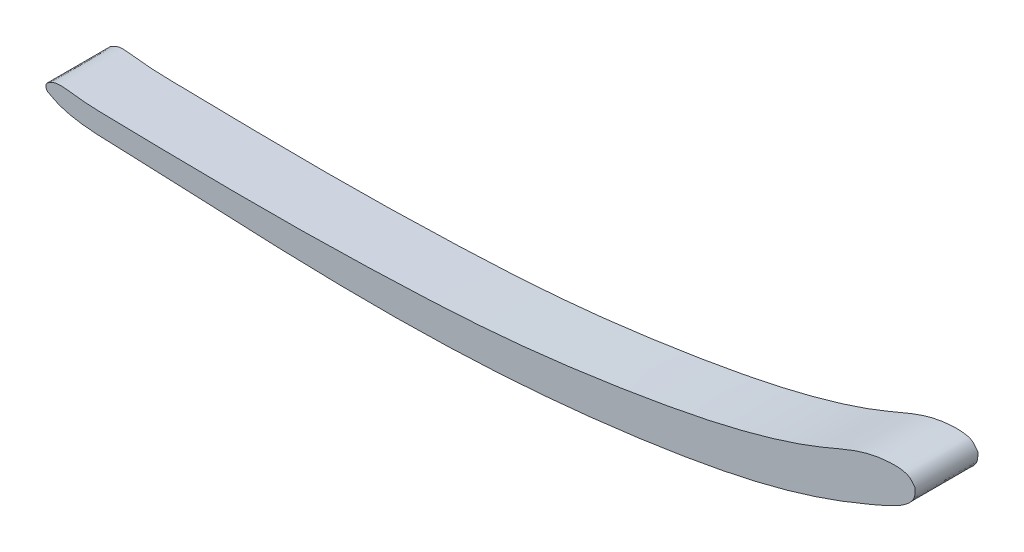
ISO-10303-21;
HEADER;
FILE_DESCRIPTION(('STEP AP214'),'2;1');
FILE_NAME('part.step','',(''),(''),'','','');
FILE_SCHEMA(('AUTOMOTIVE_DESIGN { 1 0 10303 214 1 1 1 1 }'));
ENDSEC;
DATA;
#1=APPLICATION_CONTEXT('core data for automotive mechanical design processes');
#2=APPLICATION_PROTOCOL_DEFINITION('international standard','automotive_design',2000,#1);
#3=PRODUCT_CONTEXT('',#1,'mechanical');
#4=PRODUCT('Part','Part','',(#3));
#5=PRODUCT_RELATED_PRODUCT_CATEGORY('part','',(#4));
#6=PRODUCT_DEFINITION_FORMATION('','',#4);
#7=PRODUCT_DEFINITION_CONTEXT('part definition',#1,'design');
#8=PRODUCT_DEFINITION('design','',#6,#7);
#9=PRODUCT_DEFINITION_SHAPE('','',#8);
#10=(LENGTH_UNIT() NAMED_UNIT(*) SI_UNIT(.MILLI.,.METRE.));
#11=(NAMED_UNIT(*) PLANE_ANGLE_UNIT() SI_UNIT($,.RADIAN.));
#12=(NAMED_UNIT(*) SI_UNIT($,.STERADIAN.) SOLID_ANGLE_UNIT());
#13=UNCERTAINTY_MEASURE_WITH_UNIT(LENGTH_MEASURE(1.E-05),#10,'distance_accuracy_value','');
#14=(GEOMETRIC_REPRESENTATION_CONTEXT(3) GLOBAL_UNCERTAINTY_ASSIGNED_CONTEXT((#13)) GLOBAL_UNIT_ASSIGNED_CONTEXT((#10,
#11,#12)) REPRESENTATION_CONTEXT('',''));
#15=CARTESIAN_POINT('',(0.,0.,0.));
#16=DIRECTION('',(0.,0.,1.));
#17=DIRECTION('',(1.,0.,0.));
#18=AXIS2_PLACEMENT_3D('',#15,#16,#17);
#19=CARTESIAN_POINT('',(46.4351717986592,0.,460.));
#20=CARTESIAN_POINT('',(46.4186372723807,0.0743446775304801,460.));
#21=CARTESIAN_POINT('',(46.3761599877016,0.137245472574765,460.));
#22=CARTESIAN_POINT('',(46.2860795134238,0.257408117215391,460.));
#23=CARTESIAN_POINT('',(46.2375075922615,0.314645480837497,460.));
#24=CARTESIAN_POINT('',(46.0953734615329,0.489241752612654,460.));
#25=CARTESIAN_POINT('',(46.0015336887048,0.607589118492888,460.));
#26=CARTESIAN_POINT('',(45.8431860506122,0.76544987348548,460.));
#27=CARTESIAN_POINT('',(45.7879385352865,0.815076835152043,460.));
#28=CARTESIAN_POINT('',(45.6686124592112,0.903606941360283,460.));
#29=CARTESIAN_POINT('',(45.6044705935963,0.942906170868243,460.));
#30=CARTESIAN_POINT('',(45.4027261538324,1.04645809292409,460.));
#31=CARTESIAN_POINT('',(45.2614401335263,1.09412567544684,460.));
#32=CARTESIAN_POINT('',(44.9723273837335,1.16887745902979,460.));
#33=CARTESIAN_POINT('',(44.8237831430812,1.19542069086483,460.));
#34=CARTESIAN_POINT('',(44.5279935112421,1.23670300153864,460.));
#35=CARTESIAN_POINT('',(44.3800378863314,1.25128325836084,460.));
#36=CARTESIAN_POINT('',(43.9360098396233,1.27895984206486,460.));
#37=CARTESIAN_POINT('',(43.6397887610819,1.27723938901035,460.));
#38=CARTESIAN_POINT('',(42.7508422100969,1.24383967863166,460.));
#39=CARTESIAN_POINT('',(42.1557240898738,1.17881520813178,460.));
#40=CARTESIAN_POINT('',(40.9905847973609,0.985229528037285,460.));
#41=CARTESIAN_POINT('',(40.4177603703046,0.854338355518666,460.));
#42=CARTESIAN_POINT('',(38.7270505281398,0.364521104788171,460.));
#43=CARTESIAN_POINT('',(37.6346439223606,-0.0841017426447405,460.));
#44=CARTESIAN_POINT('',(36.0010032960146,-0.772607605956821,460.));
#45=CARTESIAN_POINT('',(35.4569347882524,-1.00352290189625,460.));
#46=CARTESIAN_POINT('',(34.3644044674491,-1.45237343500906,460.));
#47=CARTESIAN_POINT('',(33.8163601976547,-1.6715423073469,460.));
#48=CARTESIAN_POINT('',(32.162948261601,-2.3016336636775,460.));
#49=CARTESIAN_POINT('',(31.0484835463983,-2.68567883722042,460.));
#50=CARTESIAN_POINT('',(28.8025601470023,-3.40356035469862,460.));
#51=CARTESIAN_POINT('',(27.6712288081569,-3.73777294157478,460.));
#52=CARTESIAN_POINT('',(25.3963591822837,-4.37013258045034,460.));
#53=CARTESIAN_POINT('',(24.2518655042759,-4.6675028122085,460.));
#54=CARTESIAN_POINT('',(21.9545661819844,-5.22375026435309,460.));
#55=CARTESIAN_POINT('',(20.8016885818415,-5.48315055280575,460.));
#56=CARTESIAN_POINT('',(17.333160096135,-6.2175283530416,460.));
#57=CARTESIAN_POINT('',(15.0089863709925,-6.65117390946139,460.));
#58=CARTESIAN_POINT('',(10.3511768358627,-7.45042093384826,460.));
#59=CARTESIAN_POINT('',(8.01617378270963,-7.81366133556785,460.));
#60=CARTESIAN_POINT('',(3.33607146339705,-8.47990690930557,460.));
#61=CARTESIAN_POINT('',(0.992184562311385,-8.78338019983148,460.));
#62=CARTESIAN_POINT('',(-3.70390698545114,-9.31077836115737,460.));
#63=CARTESIAN_POINT('',(-6.05684066936937,-9.53290527023246,460.));
#64=CARTESIAN_POINT('',(-10.7708650876107,-9.89320189523225,460.));
#65=CARTESIAN_POINT('',(-13.1300847350581,-10.0315775120267,460.));
#66=CARTESIAN_POINT('',(-17.8512213400775,-10.2572859084493,460.));
#67=CARTESIAN_POINT('',(-20.2132082771932,-10.3462040671284,460.));
#68=CARTESIAN_POINT('',(-24.9380296947424,-10.4935918801842,460.));
#69=CARTESIAN_POINT('',(-27.3007563368059,-10.5519657113286,460.));
#70=CARTESIAN_POINT('',(-32.0270086640777,-10.6299665822933,460.));
#71=CARTESIAN_POINT('',(-34.3906893237368,-10.6484364608063,460.));
#72=CARTESIAN_POINT('',(-39.1179568878443,-10.6489224582123,460.));
#73=CARTESIAN_POINT('',(-41.4815920306383,-10.6307340634627,460.));
#74=CARTESIAN_POINT('',(-46.2086292419587,-10.5763153447104,460.));
#75=CARTESIAN_POINT('',(-48.5720697898891,-10.5425988089742,460.));
#76=CARTESIAN_POINT('',(-52.1171266483451,-10.4857504205523,460.));
#77=CARTESIAN_POINT('',(-53.2988138734748,-10.4665851100126,460.));
#78=CARTESIAN_POINT('',(-55.0712098260504,-10.4309607291431,460.));
#79=CARTESIAN_POINT('',(-55.6619880156493,-10.4181211110836,460.));
#80=CARTESIAN_POINT('',(-56.8435612906097,-10.3932385729626,460.));
#81=CARTESIAN_POINT('',(-57.4344819728385,-10.3802150054318,460.));
#82=CARTESIAN_POINT('',(-58.6147419358327,-10.3343571406037,460.));
#83=CARTESIAN_POINT('',(-59.2040044417826,-10.3004628269957,460.));
#84=CARTESIAN_POINT('',(-60.0854847745448,-10.2191142858768,460.));
#85=CARTESIAN_POINT('',(-60.3789194757173,-10.1870420380267,460.));
#86=CARTESIAN_POINT('',(-60.9650787090845,-10.1139206050761,460.));
#87=CARTESIAN_POINT('',(-61.257705430093,-10.0716350313017,460.));
#88=CARTESIAN_POINT('',(-61.8443692286899,-10.0048915880233,460.));
#89=CARTESIAN_POINT('',(-62.1380229226529,-9.97875579065392,460.));
#90=CARTESIAN_POINT('',(-62.7268977800032,-9.97291464667589,460.));
#91=CARTESIAN_POINT('',(-63.0265309113463,-9.99531606647185,460.));
#92=CARTESIAN_POINT('',(-63.4442620255096,-10.1231616054288,460.));
#93=CARTESIAN_POINT('',(-63.5786893754357,-10.1825867543003,460.));
#94=CARTESIAN_POINT('',(-63.8414391770913,-10.3207548617521,460.));
#95=CARTESIAN_POINT('',(-63.9674456925139,-10.3992457710013,460.));
#96=CARTESIAN_POINT('',(-64.1548766368683,-10.519170691545,460.));
#97=CARTESIAN_POINT('',(-64.2182987684108,-10.5599833238348,460.));
#98=CARTESIAN_POINT('',(-64.3128744475431,-10.6771502898765,460.));
#99=CARTESIAN_POINT('',(-64.3415018122142,-10.7490300311806,460.));
#100=CARTESIAN_POINT('',(-64.3618479002334,-10.8979204912594,460.));
#101=CARTESIAN_POINT('',(-64.3548144586184,-10.9729466151108,460.));
#102=CARTESIAN_POINT('',(-64.3414951490408,-11.1208342049398,460.));
#103=CARTESIAN_POINT('',(-64.3320514861631,-11.1944695020643,460.));
#104=CARTESIAN_POINT('',(-64.2855347526592,-11.3386784632434,460.));
#105=CARTESIAN_POINT('',(-64.2455555589753,-11.4055752632509,460.));
#106=CARTESIAN_POINT('',(-64.1303488233841,-11.5010137367741,460.));
#107=CARTESIAN_POINT('',(-64.0611844564138,-11.5338940856425,460.));
#108=CARTESIAN_POINT('',(-63.8570513785592,-11.6296095389817,460.));
#109=CARTESIAN_POINT('',(-63.7228004430275,-11.6969009014852,460.));
#110=CARTESIAN_POINT('',(-63.4577238016445,-11.8390057530564,460.));
#111=CARTESIAN_POINT('',(-63.3259759869835,-11.912029184187,460.));
#112=CARTESIAN_POINT('',(-63.0578859679728,-12.0466206415748,460.));
#113=CARTESIAN_POINT('',(-62.9213552264004,-12.1077185792309,460.));
#114=CARTESIAN_POINT('',(-62.5053604058577,-12.2750485031099,460.));
#115=CARTESIAN_POINT('',(-62.2201002117257,-12.3668287666071,460.));
#116=CARTESIAN_POINT('',(-61.6416932759157,-12.5307253988698,460.));
#117=CARTESIAN_POINT('',(-61.3491226765273,-12.6023833536282,460.));
#118=CARTESIAN_POINT('',(-60.4713207100424,-12.7877212149722,460.));
#119=CARTESIAN_POINT('',(-59.8822710316179,-12.8715519713929,460.));
#120=CARTESIAN_POINT('',(-58.6997765552341,-12.9938413852634,460.));
#121=CARTESIAN_POINT('',(-58.1065281164907,-13.0343271160855,460.));
#122=CARTESIAN_POINT('',(-56.3243271449399,-13.1304338635014,460.));
#123=CARTESIAN_POINT('',(-55.1330834339964,-13.1625182170488,460.));
#124=CARTESIAN_POINT('',(-52.7516831564506,-13.2368814577406,460.));
#125=CARTESIAN_POINT('',(-51.5610875559045,-13.2769256908773,460.));
#126=CARTESIAN_POINT('',(-47.989997979388,-13.4161507894439,460.));
#127=CARTESIAN_POINT('',(-45.6100025309392,-13.5284946916282,460.));
#128=CARTESIAN_POINT('',(-40.8500160573623,-13.751321018182,460.));
#129=CARTESIAN_POINT('',(-38.4699385743557,-13.8607977552841,460.));
#130=CARTESIAN_POINT('',(-31.3272746595149,-14.1333399497216,460.));
#131=CARTESIAN_POINT('',(-26.5635357545341,-14.2455431960744,460.));
#132=CARTESIAN_POINT('',(-17.0329050484907,-14.2382801194071,460.));
#133=CARTESIAN_POINT('',(-12.2695762220233,-14.1213192822723,460.));
#134=CARTESIAN_POINT('',(-2.75291207263111,-13.5911299655347,460.));
#135=CARTESIAN_POINT('',(1.99335645884498,-13.1741606081946,460.));
#136=CARTESIAN_POINT('',(9.09281222572469,-12.3396173635338,460.));
#137=CARTESIAN_POINT('',(11.4542198509949,-12.0268837310582,460.));
#138=CARTESIAN_POINT('',(16.1657693401702,-11.32475456559,460.));
#139=CARTESIAN_POINT('',(18.5168595935656,-10.935615966224,460.));
#140=CARTESIAN_POINT('',(23.1984955701954,-10.0456650100157,460.));
#141=CARTESIAN_POINT('',(25.527152491198,-9.54556976171432,460.));
#142=CARTESIAN_POINT('',(30.1466982928753,-8.37419645276283,460.));
#143=CARTESIAN_POINT('',(32.4342941053931,-7.70219969835588,460.));
#144=CARTESIAN_POINT('',(36.945094532552,-6.1590221993532,460.));
#145=CARTESIAN_POINT('',(39.1657272199499,-5.2883634352965,460.));
#146=CARTESIAN_POINT('',(41.9013403306004,-4.10693497071683,460.));
#147=CARTESIAN_POINT('',(42.4465322050832,-3.86599834970509,460.));
#148=CARTESIAN_POINT('',(43.2558213120727,-3.48650538999314,460.));
#149=CARTESIAN_POINT('',(43.5241078212943,-3.35629688652504,460.));
#150=CARTESIAN_POINT('',(44.0537872052262,-3.08360356615504,460.));
#151=CARTESIAN_POINT('',(44.3153826036094,-2.94187655443751,460.));
#152=CARTESIAN_POINT('',(44.8243655912432,-2.63486023440697,460.));
#153=CARTESIAN_POINT('',(45.0720438350596,-2.46941946557037,460.));
#154=CARTESIAN_POINT('',(45.5412422658838,-2.09775522272489,460.));
#155=CARTESIAN_POINT('',(45.7588772968987,-1.89248082594894,460.));
#156=CARTESIAN_POINT('',(46.0436596813677,-1.54555813169648,460.));
#157=CARTESIAN_POINT('',(46.1307023699316,-1.42479839179439,460.));
#158=CARTESIAN_POINT('',(46.2780163668878,-1.16589877160635,460.));
#159=CARTESIAN_POINT('',(46.3389573181145,-1.02545289107822,460.));
#160=CARTESIAN_POINT('',(46.4032966909076,-0.73864668180694,460.));
#161=CARTESIAN_POINT('',(46.4077277573448,-0.590444121776876,460.));
#162=CARTESIAN_POINT('',(46.4186043640248,-0.368872175750226,460.));
#163=CARTESIAN_POINT('',(46.4256380269333,-0.295314098233301,460.));
#164=CARTESIAN_POINT('',(46.4410054629559,-0.148133212579671,460.));
#165=CARTESIAN_POINT('',(46.4517063249377,-0.0743446775304801,460.));
#166=CARTESIAN_POINT('',(46.4351717986592,0.,460.));
#167=B_SPLINE_CURVE_WITH_KNOTS('',3,(#19,#20,#21,#22,#23,#24,#25,#26,#27,#28,#29,#30,#31,#32,
#33,#34,#35,#36,#37,#38,#39,#40,#41,#42,#43,#44,#45,#46,#47,#48,#49,#50,#51,#52,#53,#54,#55,#56,
#57,#58,#59,#60,#61,#62,#63,#64,#65,#66,#67,#68,#69,#70,#71,#72,#73,#74,#75,#76,#77,#78,#79,#80,
#81,#82,#83,#84,#85,#86,#87,#88,#89,#90,#91,#92,#93,#94,#95,#96,#97,#98,#99,#100,#101,#102,#103,
#104,#105,#106,#107,#108,#109,#110,#111,#112,#113,#114,#115,#116,#117,#118,#119,#120,#121,#122,
#123,#124,#125,#126,#127,#128,#129,#130,#131,#132,#133,#134,#135,#136,#137,#138,#139,#140,#141,
#142,#143,#144,#145,#146,#147,#148,#149,#150,#151,#152,#153,#154,#155,#156,#157,#158,#159,#160,
#161,#162,#163,#164,#165,#166),.UNSPECIFIED.,.T.,.F.,(4,2,2,2,2,2,2,2,2,2,2,2,2,2,2,2,2,2,2,2,2,
2,2,2,2,2,2,2,2,2,2,2,2,2,2,2,2,2,2,2,2,2,2,2,2,2,2,2,2,2,2,2,2,2,2,2,2,2,2,2,2,2,2,2,2,2,2,2,2,
2,2,2,2,4),(0.,0.000976562499999864,0.00195312499999973,0.00390624999999946,0.00488281249999932,
0.00585937499999918,0.00781249999999899,0.0097656249999988,0.0117187499999986,
0.0156249999999983,0.0234374999999978,0.0312499999999973,0.0468749999999963,0.0546874999999958,
0.0624999999999954,0.0781249999999944,0.0937499999999934,0.109374999999992,0.124999999999991,
0.156249999999989,0.187499999999988,0.218749999999986,0.249999999999984,0.281249999999982,
0.31249999999998,0.343749999999978,0.374999999999976,0.406249999999974,0.437499999999972,
0.453124999999971,0.460937499999971,0.46874999999997,0.47656249999997,0.480468749999969,
0.484374999999969,0.488281249999969,0.492187499999969,0.494140624999969,0.496093749999969,
0.497070312499968,0.498046874999968,0.499023437499968,0.499999999999968,0.500976562499968,
0.501953124999968,0.503906249999969,0.505859374999969,0.507812499999969,0.511718749999969,
0.515624999999969,0.52343749999997,0.53124999999997,0.546874999999971,0.562499999999972,
0.593749999999974,0.624999999999976,0.68749999999998,0.749999999999984,0.812499999999988,
0.84374999999999,0.874999999999992,0.906249999999994,0.937499999999996,0.968749999999998,
0.976562499999998,0.980468749999999,0.984374999999999,0.988281249999999,0.992187499999999,
0.994140625,0.99609375,0.998046875,0.9990234375,1.),.UNSPECIFIED.);
#168=DIRECTION('',(0.,0.,-1.));
#169=VECTOR('',#168,1.);
#170=SURFACE_OF_LINEAR_EXTRUSION('',#167,#169);
#171=CARTESIAN_POINT('',(46.4351717986592,0.,460.));
#172=CARTESIAN_POINT('',(46.4517063249377,-0.0743446775304801,460.));
#173=CARTESIAN_POINT('',(46.4410054629559,-0.148133212579671,460.));
#174=CARTESIAN_POINT('',(46.4256380269333,-0.295314098233301,460.));
#175=CARTESIAN_POINT('',(46.4186043640248,-0.368872175750226,460.));
#176=CARTESIAN_POINT('',(46.4077277573448,-0.590444121776876,460.));
#177=CARTESIAN_POINT('',(46.4032966909076,-0.73864668180694,460.));
#178=CARTESIAN_POINT('',(46.3389573181145,-1.02545289107822,460.));
#179=CARTESIAN_POINT('',(46.2780163668878,-1.16589877160635,460.));
#180=CARTESIAN_POINT('',(46.1307023699316,-1.42479839179439,460.));
#181=CARTESIAN_POINT('',(46.0436596813677,-1.54555813169648,460.));
#182=CARTESIAN_POINT('',(45.7588772968987,-1.89248082594894,460.));
#183=CARTESIAN_POINT('',(45.5412422658838,-2.09775522272489,460.));
#184=CARTESIAN_POINT('',(45.0720438350596,-2.46941946557037,460.));
#185=CARTESIAN_POINT('',(44.8243655912432,-2.63486023440697,460.));
#186=CARTESIAN_POINT('',(44.3153826036094,-2.94187655443751,460.));
#187=CARTESIAN_POINT('',(44.0537872052262,-3.08360356615504,460.));
#188=CARTESIAN_POINT('',(43.5241078212943,-3.35629688652504,460.));
#189=CARTESIAN_POINT('',(43.2558213120727,-3.48650538999314,460.));
#190=CARTESIAN_POINT('',(42.4465322050832,-3.86599834970509,460.));
#191=CARTESIAN_POINT('',(41.9013403306004,-4.10693497071683,460.));
#192=CARTESIAN_POINT('',(39.1657272199499,-5.2883634352965,460.));
#193=CARTESIAN_POINT('',(36.945094532552,-6.1590221993532,460.));
#194=CARTESIAN_POINT('',(32.4342941053931,-7.70219969835588,460.));
#195=CARTESIAN_POINT('',(30.1466982928753,-8.37419645276283,460.));
#196=CARTESIAN_POINT('',(25.527152491198,-9.54556976171432,460.));
#197=CARTESIAN_POINT('',(23.1984955701954,-10.0456650100157,460.));
#198=CARTESIAN_POINT('',(18.5168595935656,-10.935615966224,460.));
#199=CARTESIAN_POINT('',(16.1657693401702,-11.32475456559,460.));
#200=CARTESIAN_POINT('',(11.4542198509949,-12.0268837310582,460.));
#201=CARTESIAN_POINT('',(9.09281222572469,-12.3396173635338,460.));
#202=CARTESIAN_POINT('',(1.99335645884498,-13.1741606081946,460.));
#203=CARTESIAN_POINT('',(-2.75291207263111,-13.5911299655347,460.));
#204=CARTESIAN_POINT('',(-12.2695762220233,-14.1213192822723,460.));
#205=CARTESIAN_POINT('',(-17.0329050484907,-14.2382801194071,460.));
#206=CARTESIAN_POINT('',(-26.5635357545341,-14.2455431960744,460.));
#207=CARTESIAN_POINT('',(-31.3272746595149,-14.1333399497216,460.));
#208=CARTESIAN_POINT('',(-38.4699385743557,-13.8607977552841,460.));
#209=CARTESIAN_POINT('',(-40.8500160573623,-13.751321018182,460.));
#210=CARTESIAN_POINT('',(-45.6100025309392,-13.5284946916282,460.));
#211=CARTESIAN_POINT('',(-47.989997979388,-13.4161507894439,460.));
#212=CARTESIAN_POINT('',(-51.5610875559045,-13.2769256908773,460.));
#213=CARTESIAN_POINT('',(-52.7516831564506,-13.2368814577406,460.));
#214=CARTESIAN_POINT('',(-55.1330834339964,-13.1625182170488,460.));
#215=CARTESIAN_POINT('',(-56.3243271449399,-13.1304338635014,460.));
#216=CARTESIAN_POINT('',(-58.1065281164907,-13.0343271160855,460.));
#217=CARTESIAN_POINT('',(-58.6997765552341,-12.9938413852634,460.));
#218=CARTESIAN_POINT('',(-59.8822710316179,-12.8715519713929,460.));
#219=CARTESIAN_POINT('',(-60.4713207100424,-12.7877212149722,460.));
#220=CARTESIAN_POINT('',(-61.3491226765273,-12.6023833536282,460.));
#221=CARTESIAN_POINT('',(-61.6416932759157,-12.5307253988698,460.));
#222=CARTESIAN_POINT('',(-62.2201002117257,-12.3668287666071,460.));
#223=CARTESIAN_POINT('',(-62.5053604058577,-12.2750485031099,460.));
#224=CARTESIAN_POINT('',(-62.9213552264004,-12.1077185792309,460.));
#225=CARTESIAN_POINT('',(-63.0578859679728,-12.0466206415748,460.));
#226=CARTESIAN_POINT('',(-63.3259759869835,-11.912029184187,460.));
#227=CARTESIAN_POINT('',(-63.4577238016445,-11.8390057530564,460.));
#228=CARTESIAN_POINT('',(-63.7228004430275,-11.6969009014852,460.));
#229=CARTESIAN_POINT('',(-63.8570513785592,-11.6296095389817,460.));
#230=CARTESIAN_POINT('',(-64.0611844564138,-11.5338940856425,460.));
#231=CARTESIAN_POINT('',(-64.1303488233841,-11.5010137367741,460.));
#232=CARTESIAN_POINT('',(-64.2455555589753,-11.4055752632509,460.));
#233=CARTESIAN_POINT('',(-64.2855347526592,-11.3386784632434,460.));
#234=CARTESIAN_POINT('',(-64.3320514861631,-11.1944695020643,460.));
#235=CARTESIAN_POINT('',(-64.3414951490408,-11.1208342049398,460.));
#236=CARTESIAN_POINT('',(-64.3548144586184,-10.9729466151108,460.));
#237=CARTESIAN_POINT('',(-64.3618479002334,-10.8979204912594,460.));
#238=CARTESIAN_POINT('',(-64.3415018122142,-10.7490300311806,460.));
#239=CARTESIAN_POINT('',(-64.3128744475431,-10.6771502898765,460.));
#240=CARTESIAN_POINT('',(-64.2182987684108,-10.5599833238348,460.));
#241=CARTESIAN_POINT('',(-64.1548766368683,-10.519170691545,460.));
#242=CARTESIAN_POINT('',(-63.9674456925139,-10.3992457710013,460.));
#243=CARTESIAN_POINT('',(-63.8414391770913,-10.3207548617521,460.));
#244=CARTESIAN_POINT('',(-63.5786893754357,-10.1825867543003,460.));
#245=CARTESIAN_POINT('',(-63.4442620255096,-10.1231616054288,460.));
#246=CARTESIAN_POINT('',(-63.0265309113463,-9.99531606647185,460.));
#247=CARTESIAN_POINT('',(-62.7268977800032,-9.97291464667589,460.));
#248=CARTESIAN_POINT('',(-62.1380229226529,-9.97875579065392,460.));
#249=CARTESIAN_POINT('',(-61.8443692286899,-10.0048915880233,460.));
#250=CARTESIAN_POINT('',(-61.257705430093,-10.0716350313017,460.));
#251=CARTESIAN_POINT('',(-60.9650787090845,-10.1139206050761,460.));
#252=CARTESIAN_POINT('',(-60.3789194757173,-10.1870420380267,460.));
#253=CARTESIAN_POINT('',(-60.0854847745448,-10.2191142858768,460.));
#254=CARTESIAN_POINT('',(-59.2040044417826,-10.3004628269957,460.));
#255=CARTESIAN_POINT('',(-58.6147419358327,-10.3343571406037,460.));
#256=CARTESIAN_POINT('',(-57.4344819728385,-10.3802150054318,460.));
#257=CARTESIAN_POINT('',(-56.8435612906097,-10.3932385729626,460.));
#258=CARTESIAN_POINT('',(-55.6619880156493,-10.4181211110836,460.));
#259=CARTESIAN_POINT('',(-55.0712098260504,-10.4309607291431,460.));
#260=CARTESIAN_POINT('',(-53.2988138734748,-10.4665851100126,460.));
#261=CARTESIAN_POINT('',(-52.1171266483451,-10.4857504205523,460.));
#262=CARTESIAN_POINT('',(-48.5720697898891,-10.5425988089742,460.));
#263=CARTESIAN_POINT('',(-46.2086292419587,-10.5763153447104,460.));
#264=CARTESIAN_POINT('',(-41.4815920306383,-10.6307340634627,460.));
#265=CARTESIAN_POINT('',(-39.1179568878443,-10.6489224582123,460.));
#266=CARTESIAN_POINT('',(-34.3906893237368,-10.6484364608063,460.));
#267=CARTESIAN_POINT('',(-32.0270086640777,-10.6299665822933,460.));
#268=CARTESIAN_POINT('',(-27.3007563368059,-10.5519657113286,460.));
#269=CARTESIAN_POINT('',(-24.9380296947424,-10.4935918801842,460.));
#270=CARTESIAN_POINT('',(-20.2132082771932,-10.3462040671284,460.));
#271=CARTESIAN_POINT('',(-17.8512213400775,-10.2572859084493,460.));
#272=CARTESIAN_POINT('',(-13.1300847350581,-10.0315775120267,460.));
#273=CARTESIAN_POINT('',(-10.7708650876107,-9.89320189523225,460.));
#274=CARTESIAN_POINT('',(-6.05684066936937,-9.53290527023246,460.));
#275=CARTESIAN_POINT('',(-3.70390698545114,-9.31077836115737,460.));
#276=CARTESIAN_POINT('',(0.992184562311385,-8.78338019983148,460.));
#277=CARTESIAN_POINT('',(3.33607146339705,-8.47990690930557,460.));
#278=CARTESIAN_POINT('',(8.01617378270963,-7.81366133556785,460.));
#279=CARTESIAN_POINT('',(10.3511768358627,-7.45042093384826,460.));
#280=CARTESIAN_POINT('',(15.0089863709925,-6.65117390946139,460.));
#281=CARTESIAN_POINT('',(17.333160096135,-6.2175283530416,460.));
#282=CARTESIAN_POINT('',(20.8016885818415,-5.48315055280575,460.));
#283=CARTESIAN_POINT('',(21.9545661819844,-5.22375026435309,460.));
#284=CARTESIAN_POINT('',(24.2518655042759,-4.6675028122085,460.));
#285=CARTESIAN_POINT('',(25.3963591822837,-4.37013258045034,460.));
#286=CARTESIAN_POINT('',(27.6712288081569,-3.73777294157478,460.));
#287=CARTESIAN_POINT('',(28.8025601470023,-3.40356035469862,460.));
#288=CARTESIAN_POINT('',(31.0484835463983,-2.68567883722042,460.));
#289=CARTESIAN_POINT('',(32.162948261601,-2.3016336636775,460.));
#290=CARTESIAN_POINT('',(33.8163601976547,-1.6715423073469,460.));
#291=CARTESIAN_POINT('',(34.3644044674491,-1.45237343500906,460.));
#292=CARTESIAN_POINT('',(35.4569347882524,-1.00352290189625,460.));
#293=CARTESIAN_POINT('',(36.0010032960146,-0.772607605956821,460.));
#294=CARTESIAN_POINT('',(37.6346439223606,-0.0841017426447405,460.));
#295=CARTESIAN_POINT('',(38.7270505281398,0.364521104788171,460.));
#296=CARTESIAN_POINT('',(40.4177603703046,0.854338355518666,460.));
#297=CARTESIAN_POINT('',(40.9905847973609,0.985229528037285,460.));
#298=CARTESIAN_POINT('',(42.1557240898738,1.17881520813178,460.));
#299=CARTESIAN_POINT('',(42.7508422100969,1.24383967863166,460.));
#300=CARTESIAN_POINT('',(43.6397887610819,1.27723938901035,460.));
#301=CARTESIAN_POINT('',(43.9360098396233,1.27895984206486,460.));
#302=CARTESIAN_POINT('',(44.3800378863314,1.25128325836084,460.));
#303=CARTESIAN_POINT('',(44.5279935112421,1.23670300153864,460.));
#304=CARTESIAN_POINT('',(44.8237831430812,1.19542069086483,460.));
#305=CARTESIAN_POINT('',(44.9723273837335,1.16887745902979,460.));
#306=CARTESIAN_POINT('',(45.2614401335263,1.09412567544684,460.));
#307=CARTESIAN_POINT('',(45.4027261538324,1.04645809292409,460.));
#308=CARTESIAN_POINT('',(45.6044705935963,0.942906170868243,460.));
#309=CARTESIAN_POINT('',(45.6686124592112,0.903606941360283,460.));
#310=CARTESIAN_POINT('',(45.7879385352865,0.815076835152043,460.));
#311=CARTESIAN_POINT('',(45.8431860506122,0.76544987348548,460.));
#312=CARTESIAN_POINT('',(46.0015336887048,0.607589118492888,460.));
#313=CARTESIAN_POINT('',(46.0953734615329,0.489241752612654,460.));
#314=CARTESIAN_POINT('',(46.2375075922615,0.314645480837497,460.));
#315=CARTESIAN_POINT('',(46.2860795134238,0.257408117215391,460.));
#316=CARTESIAN_POINT('',(46.3761599877016,0.137245472574765,460.));
#317=CARTESIAN_POINT('',(46.4186372723807,0.0743446775304801,460.));
#318=CARTESIAN_POINT('',(46.4351717986592,0.,460.));
#319=B_SPLINE_CURVE_WITH_KNOTS('',3,(#171,#172,#173,#174,#175,#176,#177,#178,#179,#180,#181,
#182,#183,#184,#185,#186,#187,#188,#189,#190,#191,#192,#193,#194,#195,#196,#197,#198,#199,#200,
#201,#202,#203,#204,#205,#206,#207,#208,#209,#210,#211,#212,#213,#214,#215,#216,#217,#218,#219,
#220,#221,#222,#223,#224,#225,#226,#227,#228,#229,#230,#231,#232,#233,#234,#235,#236,#237,#238,
#239,#240,#241,#242,#243,#244,#245,#246,#247,#248,#249,#250,#251,#252,#253,#254,#255,#256,#257,
#258,#259,#260,#261,#262,#263,#264,#265,#266,#267,#268,#269,#270,#271,#272,#273,#274,#275,#276,
#277,#278,#279,#280,#281,#282,#283,#284,#285,#286,#287,#288,#289,#290,#291,#292,#293,#294,#295,
#296,#297,#298,#299,#300,#301,#302,#303,#304,#305,#306,#307,#308,#309,#310,#311,#312,#313,#314,
#315,#316,#317,#318),.UNSPECIFIED.,.T.,.F.,(4,2,2,2,2,2,2,2,2,2,2,2,2,2,2,2,2,2,2,2,2,2,2,2,2,2,
2,2,2,2,2,2,2,2,2,2,2,2,2,2,2,2,2,2,2,2,2,2,2,2,2,2,2,2,2,2,2,2,2,2,2,2,2,2,2,2,2,2,2,2,2,2,2,
4),(0.,0.0009765625,0.00195312500000011,0.00390625000000022,0.00585937500000044,
0.00781250000000056,0.0117187500000008,0.015625000000001,0.0195312500000013,0.0234375000000016,
0.0312500000000021,0.0625000000000041,0.093750000000006,0.125000000000008,0.15625000000001,
0.187500000000012,0.250000000000016,0.31250000000002,0.375000000000024,0.406250000000026,
0.437500000000028,0.453125000000029,0.46875000000003,0.47656250000003,0.484375000000031,
0.488281250000031,0.492187500000031,0.494140625000031,0.496093750000031,0.498046875000032,
0.499023437500032,0.500000000000032,0.500976562500032,0.501953125000032,0.502929687500032,
0.503906250000032,0.505859375000031,0.507812500000031,0.511718750000031,0.515625000000031,
0.519531250000031,0.52343750000003,0.53125000000003,0.539062500000029,0.546875000000029,
0.562500000000028,0.593750000000026,0.625000000000024,0.656250000000022,0.68750000000002,
0.718750000000018,0.750000000000016,0.781250000000014,0.812500000000012,0.843750000000011,
0.875000000000009,0.890625000000008,0.906250000000007,0.921875000000006,0.937500000000005,
0.945312500000004,0.953125000000004,0.968750000000003,0.976562500000002,0.984375000000002,
0.988281250000001,0.990234375000001,0.992187500000001,0.994140625000001,0.995117187500001,
0.996093750000001,0.998046875,0.9990234375,1.),.UNSPECIFIED.);
#320=CARTESIAN_POINT('',(46.4351717986592,0.,460.));
#321=VERTEX_POINT('',#320);
#322=EDGE_CURVE('E10',#321,#321,#319,.F.);
#323=ORIENTED_EDGE('',*,*,#322,.F.);
#324=EDGE_LOOP('',(#323));
#325=FACE_BOUND('',#324,.T.);
#326=CARTESIAN_POINT('',(46.4351717986592,0.,452.));
#327=CARTESIAN_POINT('',(46.4186372723807,0.0743446775304801,452.));
#328=CARTESIAN_POINT('',(46.3761599877016,0.137245472574765,452.));
#329=CARTESIAN_POINT('',(46.2860795134238,0.257408117215391,452.));
#330=CARTESIAN_POINT('',(46.2375075922615,0.314645480837497,452.));
#331=CARTESIAN_POINT('',(46.0953734615329,0.489241752612654,452.));
#332=CARTESIAN_POINT('',(46.0015336887048,0.607589118492888,452.));
#333=CARTESIAN_POINT('',(45.8431860506122,0.76544987348548,452.));
#334=CARTESIAN_POINT('',(45.7879385352865,0.815076835152043,452.));
#335=CARTESIAN_POINT('',(45.6686124592112,0.903606941360283,452.));
#336=CARTESIAN_POINT('',(45.6044705935963,0.942906170868243,452.));
#337=CARTESIAN_POINT('',(45.4027261538324,1.04645809292409,452.));
#338=CARTESIAN_POINT('',(45.2614401335263,1.09412567544684,452.));
#339=CARTESIAN_POINT('',(44.9723273837335,1.16887745902979,452.));
#340=CARTESIAN_POINT('',(44.8237831430812,1.19542069086483,452.));
#341=CARTESIAN_POINT('',(44.5279935112421,1.23670300153864,452.));
#342=CARTESIAN_POINT('',(44.3800378863314,1.25128325836084,452.));
#343=CARTESIAN_POINT('',(43.9360098396233,1.27895984206486,452.));
#344=CARTESIAN_POINT('',(43.6397887610819,1.27723938901035,452.));
#345=CARTESIAN_POINT('',(42.7508422100969,1.24383967863166,452.));
#346=CARTESIAN_POINT('',(42.1557240898738,1.17881520813178,452.));
#347=CARTESIAN_POINT('',(40.9905847973609,0.985229528037285,452.));
#348=CARTESIAN_POINT('',(40.4177603703046,0.854338355518666,452.));
#349=CARTESIAN_POINT('',(38.7270505281398,0.364521104788171,452.));
#350=CARTESIAN_POINT('',(37.6346439223606,-0.0841017426447405,452.));
#351=CARTESIAN_POINT('',(36.0010032960146,-0.772607605956821,452.));
#352=CARTESIAN_POINT('',(35.4569347882524,-1.00352290189625,452.));
#353=CARTESIAN_POINT('',(34.3644044674491,-1.45237343500906,452.));
#354=CARTESIAN_POINT('',(33.8163601976547,-1.6715423073469,452.));
#355=CARTESIAN_POINT('',(32.162948261601,-2.3016336636775,452.));
#356=CARTESIAN_POINT('',(31.0484835463983,-2.68567883722042,452.));
#357=CARTESIAN_POINT('',(28.8025601470023,-3.40356035469862,452.));
#358=CARTESIAN_POINT('',(27.6712288081569,-3.73777294157478,452.));
#359=CARTESIAN_POINT('',(25.3963591822837,-4.37013258045034,452.));
#360=CARTESIAN_POINT('',(24.2518655042759,-4.6675028122085,452.));
#361=CARTESIAN_POINT('',(21.9545661819844,-5.22375026435309,452.));
#362=CARTESIAN_POINT('',(20.8016885818415,-5.48315055280575,452.));
#363=CARTESIAN_POINT('',(17.333160096135,-6.2175283530416,452.));
#364=CARTESIAN_POINT('',(15.0089863709925,-6.65117390946139,452.));
#365=CARTESIAN_POINT('',(10.3511768358627,-7.45042093384826,452.));
#366=CARTESIAN_POINT('',(8.01617378270963,-7.81366133556785,452.));
#367=CARTESIAN_POINT('',(3.33607146339705,-8.47990690930557,452.));
#368=CARTESIAN_POINT('',(0.992184562311385,-8.78338019983148,452.));
#369=CARTESIAN_POINT('',(-3.70390698545114,-9.31077836115737,452.));
#370=CARTESIAN_POINT('',(-6.05684066936937,-9.53290527023246,452.));
#371=CARTESIAN_POINT('',(-10.7708650876107,-9.89320189523225,452.));
#372=CARTESIAN_POINT('',(-13.1300847350581,-10.0315775120267,452.));
#373=CARTESIAN_POINT('',(-17.8512213400775,-10.2572859084493,452.));
#374=CARTESIAN_POINT('',(-20.2132082771932,-10.3462040671284,452.));
#375=CARTESIAN_POINT('',(-24.9380296947424,-10.4935918801842,452.));
#376=CARTESIAN_POINT('',(-27.3007563368059,-10.5519657113286,452.));
#377=CARTESIAN_POINT('',(-32.0270086640777,-10.6299665822933,452.));
#378=CARTESIAN_POINT('',(-34.3906893237368,-10.6484364608063,452.));
#379=CARTESIAN_POINT('',(-39.1179568878443,-10.6489224582123,452.));
#380=CARTESIAN_POINT('',(-41.4815920306383,-10.6307340634627,452.));
#381=CARTESIAN_POINT('',(-46.2086292419587,-10.5763153447104,452.));
#382=CARTESIAN_POINT('',(-48.5720697898891,-10.5425988089742,452.));
#383=CARTESIAN_POINT('',(-52.1171266483451,-10.4857504205523,452.));
#384=CARTESIAN_POINT('',(-53.2988138734748,-10.4665851100126,452.));
#385=CARTESIAN_POINT('',(-55.0712098260504,-10.4309607291431,452.));
#386=CARTESIAN_POINT('',(-55.6619880156493,-10.4181211110836,452.));
#387=CARTESIAN_POINT('',(-56.8435612906097,-10.3932385729626,452.));
#388=CARTESIAN_POINT('',(-57.4344819728385,-10.3802150054318,452.));
#389=CARTESIAN_POINT('',(-58.6147419358327,-10.3343571406037,452.));
#390=CARTESIAN_POINT('',(-59.2040044417826,-10.3004628269957,452.));
#391=CARTESIAN_POINT('',(-60.0854847745448,-10.2191142858768,452.));
#392=CARTESIAN_POINT('',(-60.3789194757173,-10.1870420380267,452.));
#393=CARTESIAN_POINT('',(-60.9650787090845,-10.1139206050761,452.));
#394=CARTESIAN_POINT('',(-61.257705430093,-10.0716350313017,452.));
#395=CARTESIAN_POINT('',(-61.8443692286899,-10.0048915880233,452.));
#396=CARTESIAN_POINT('',(-62.1380229226529,-9.97875579065392,452.));
#397=CARTESIAN_POINT('',(-62.7268977800032,-9.97291464667589,452.));
#398=CARTESIAN_POINT('',(-63.0265309113463,-9.99531606647185,452.));
#399=CARTESIAN_POINT('',(-63.4442620255096,-10.1231616054288,452.));
#400=CARTESIAN_POINT('',(-63.5786893754357,-10.1825867543003,452.));
#401=CARTESIAN_POINT('',(-63.8414391770913,-10.3207548617521,452.));
#402=CARTESIAN_POINT('',(-63.9674456925139,-10.3992457710013,452.));
#403=CARTESIAN_POINT('',(-64.1548766368683,-10.519170691545,452.));
#404=CARTESIAN_POINT('',(-64.2182987684108,-10.5599833238348,452.));
#405=CARTESIAN_POINT('',(-64.3128744475431,-10.6771502898765,452.));
#406=CARTESIAN_POINT('',(-64.3415018122142,-10.7490300311806,452.));
#407=CARTESIAN_POINT('',(-64.3618479002334,-10.8979204912594,452.));
#408=CARTESIAN_POINT('',(-64.3548144586184,-10.9729466151108,452.));
#409=CARTESIAN_POINT('',(-64.3414951490408,-11.1208342049398,452.));
#410=CARTESIAN_POINT('',(-64.3320514861631,-11.1944695020643,452.));
#411=CARTESIAN_POINT('',(-64.2855347526592,-11.3386784632434,452.));
#412=CARTESIAN_POINT('',(-64.2455555589753,-11.4055752632509,452.));
#413=CARTESIAN_POINT('',(-64.1303488233841,-11.5010137367741,452.));
#414=CARTESIAN_POINT('',(-64.0611844564138,-11.5338940856425,452.));
#415=CARTESIAN_POINT('',(-63.8570513785592,-11.6296095389817,452.));
#416=CARTESIAN_POINT('',(-63.7228004430275,-11.6969009014852,452.));
#417=CARTESIAN_POINT('',(-63.4577238016445,-11.8390057530564,452.));
#418=CARTESIAN_POINT('',(-63.3259759869835,-11.912029184187,452.));
#419=CARTESIAN_POINT('',(-63.0578859679728,-12.0466206415748,452.));
#420=CARTESIAN_POINT('',(-62.9213552264004,-12.1077185792309,452.));
#421=CARTESIAN_POINT('',(-62.5053604058577,-12.2750485031099,452.));
#422=CARTESIAN_POINT('',(-62.2201002117257,-12.3668287666071,452.));
#423=CARTESIAN_POINT('',(-61.6416932759157,-12.5307253988698,452.));
#424=CARTESIAN_POINT('',(-61.3491226765273,-12.6023833536282,452.));
#425=CARTESIAN_POINT('',(-60.4713207100424,-12.7877212149722,452.));
#426=CARTESIAN_POINT('',(-59.8822710316179,-12.8715519713929,452.));
#427=CARTESIAN_POINT('',(-58.6997765552341,-12.9938413852634,452.));
#428=CARTESIAN_POINT('',(-58.1065281164907,-13.0343271160855,452.));
#429=CARTESIAN_POINT('',(-56.3243271449399,-13.1304338635014,452.));
#430=CARTESIAN_POINT('',(-55.1330834339964,-13.1625182170488,452.));
#431=CARTESIAN_POINT('',(-52.7516831564506,-13.2368814577406,452.));
#432=CARTESIAN_POINT('',(-51.5610875559045,-13.2769256908773,452.));
#433=CARTESIAN_POINT('',(-47.989997979388,-13.4161507894439,452.));
#434=CARTESIAN_POINT('',(-45.6100025309392,-13.5284946916282,452.));
#435=CARTESIAN_POINT('',(-40.8500160573623,-13.751321018182,452.));
#436=CARTESIAN_POINT('',(-38.4699385743557,-13.8607977552841,452.));
#437=CARTESIAN_POINT('',(-31.3272746595149,-14.1333399497216,452.));
#438=CARTESIAN_POINT('',(-26.5635357545341,-14.2455431960744,452.));
#439=CARTESIAN_POINT('',(-17.0329050484907,-14.2382801194071,452.));
#440=CARTESIAN_POINT('',(-12.2695762220233,-14.1213192822723,452.));
#441=CARTESIAN_POINT('',(-2.75291207263111,-13.5911299655347,452.));
#442=CARTESIAN_POINT('',(1.99335645884498,-13.1741606081946,452.));
#443=CARTESIAN_POINT('',(9.09281222572469,-12.3396173635338,452.));
#444=CARTESIAN_POINT('',(11.4542198509949,-12.0268837310582,452.));
#445=CARTESIAN_POINT('',(16.1657693401702,-11.32475456559,452.));
#446=CARTESIAN_POINT('',(18.5168595935656,-10.935615966224,452.));
#447=CARTESIAN_POINT('',(23.1984955701954,-10.0456650100157,452.));
#448=CARTESIAN_POINT('',(25.527152491198,-9.54556976171432,452.));
#449=CARTESIAN_POINT('',(30.1466982928753,-8.37419645276283,452.));
#450=CARTESIAN_POINT('',(32.4342941053931,-7.70219969835588,452.));
#451=CARTESIAN_POINT('',(36.945094532552,-6.1590221993532,452.));
#452=CARTESIAN_POINT('',(39.1657272199499,-5.2883634352965,452.));
#453=CARTESIAN_POINT('',(41.9013403306004,-4.10693497071683,452.));
#454=CARTESIAN_POINT('',(42.4465322050832,-3.86599834970509,452.));
#455=CARTESIAN_POINT('',(43.2558213120727,-3.48650538999314,452.));
#456=CARTESIAN_POINT('',(43.5241078212943,-3.35629688652504,452.));
#457=CARTESIAN_POINT('',(44.0537872052262,-3.08360356615504,452.));
#458=CARTESIAN_POINT('',(44.3153826036094,-2.94187655443751,452.));
#459=CARTESIAN_POINT('',(44.8243655912432,-2.63486023440697,452.));
#460=CARTESIAN_POINT('',(45.0720438350596,-2.46941946557037,452.));
#461=CARTESIAN_POINT('',(45.5412422658838,-2.09775522272489,452.));
#462=CARTESIAN_POINT('',(45.7588772968987,-1.89248082594894,452.));
#463=CARTESIAN_POINT('',(46.0436596813677,-1.54555813169648,452.));
#464=CARTESIAN_POINT('',(46.1307023699316,-1.42479839179439,452.));
#465=CARTESIAN_POINT('',(46.2780163668878,-1.16589877160635,452.));
#466=CARTESIAN_POINT('',(46.3389573181145,-1.02545289107822,452.));
#467=CARTESIAN_POINT('',(46.4032966909076,-0.73864668180694,452.));
#468=CARTESIAN_POINT('',(46.4077277573448,-0.590444121776876,452.));
#469=CARTESIAN_POINT('',(46.4186043640248,-0.368872175750226,452.));
#470=CARTESIAN_POINT('',(46.4256380269333,-0.295314098233301,452.));
#471=CARTESIAN_POINT('',(46.4410054629559,-0.148133212579671,452.));
#472=CARTESIAN_POINT('',(46.4517063249377,-0.0743446775304801,452.));
#473=CARTESIAN_POINT('',(46.4351717986592,0.,452.));
#474=B_SPLINE_CURVE_WITH_KNOTS('',3,(#326,#327,#328,#329,#330,#331,#332,#333,#334,#335,#336,
#337,#338,#339,#340,#341,#342,#343,#344,#345,#346,#347,#348,#349,#350,#351,#352,#353,#354,#355,
#356,#357,#358,#359,#360,#361,#362,#363,#364,#365,#366,#367,#368,#369,#370,#371,#372,#373,#374,
#375,#376,#377,#378,#379,#380,#381,#382,#383,#384,#385,#386,#387,#388,#389,#390,#391,#392,#393,
#394,#395,#396,#397,#398,#399,#400,#401,#402,#403,#404,#405,#406,#407,#408,#409,#410,#411,#412,
#413,#414,#415,#416,#417,#418,#419,#420,#421,#422,#423,#424,#425,#426,#427,#428,#429,#430,#431,
#432,#433,#434,#435,#436,#437,#438,#439,#440,#441,#442,#443,#444,#445,#446,#447,#448,#449,#450,
#451,#452,#453,#454,#455,#456,#457,#458,#459,#460,#461,#462,#463,#464,#465,#466,#467,#468,#469,
#470,#471,#472,#473),.UNSPECIFIED.,.T.,.F.,(4,2,2,2,2,2,2,2,2,2,2,2,2,2,2,2,2,2,2,2,2,2,2,2,2,2,
2,2,2,2,2,2,2,2,2,2,2,2,2,2,2,2,2,2,2,2,2,2,2,2,2,2,2,2,2,2,2,2,2,2,2,2,2,2,2,2,2,2,2,2,2,2,2,
4),(0.,0.000976562499999864,0.00195312499999973,0.00390624999999946,0.00488281249999932,
0.00585937499999918,0.00781249999999899,0.0097656249999988,0.0117187499999986,
0.0156249999999983,0.0234374999999978,0.0312499999999973,0.0468749999999963,0.0546874999999958,
0.0624999999999954,0.0781249999999944,0.0937499999999934,0.109374999999992,0.124999999999991,
0.156249999999989,0.187499999999988,0.218749999999986,0.249999999999984,0.281249999999982,
0.31249999999998,0.343749999999978,0.374999999999976,0.406249999999974,0.437499999999972,
0.453124999999971,0.460937499999971,0.46874999999997,0.47656249999997,0.480468749999969,
0.484374999999969,0.488281249999969,0.492187499999969,0.494140624999969,0.496093749999969,
0.497070312499968,0.498046874999968,0.499023437499968,0.499999999999968,0.500976562499968,
0.501953124999968,0.503906249999969,0.505859374999969,0.507812499999969,0.511718749999969,
0.515624999999969,0.52343749999997,0.53124999999997,0.546874999999971,0.562499999999972,
0.593749999999974,0.624999999999976,0.68749999999998,0.749999999999984,0.812499999999988,
0.84374999999999,0.874999999999992,0.906249999999994,0.937499999999996,0.968749999999998,
0.976562499999998,0.980468749999999,0.984374999999999,0.988281249999999,0.992187499999999,
0.994140625,0.99609375,0.998046875,0.9990234375,1.),.UNSPECIFIED.);
#475=CARTESIAN_POINT('',(46.4351717986592,0.,452.));
#476=VERTEX_POINT('',#475);
#477=EDGE_CURVE('E38',#476,#476,#474,.T.);
#478=ORIENTED_EDGE('',*,*,#477,.T.);
#479=EDGE_LOOP('',(#478));
#480=FACE_BOUND('',#479,.T.);
#481=ADVANCED_FACE('F28',(#325,#480),#170,.F.);
#482=CARTESIAN_POINT('',(-64.3087931194089,-11.2665739826608,460.));
#483=DIRECTION('',(0.,0.,-1.));
#484=DIRECTION('',(-1.,0.,0.));
#485=AXIS2_PLACEMENT_3D('',#482,#483,#484);
#486=PLANE('',#485);
#487=ORIENTED_EDGE('',*,*,#322,.T.);
#488=EDGE_LOOP('',(#487));
#489=FACE_BOUND('',#488,.T.);
#490=ADVANCED_FACE('F69',(#489),#486,.F.);
#491=CARTESIAN_POINT('',(-64.3087931194089,-11.2665739826608,452.));
#492=DIRECTION('',(0.,0.,-1.));
#493=DIRECTION('',(-1.,0.,0.));
#494=AXIS2_PLACEMENT_3D('',#491,#492,#493);
#495=PLANE('',#494);
#496=ORIENTED_EDGE('',*,*,#477,.F.);
#497=EDGE_LOOP('',(#496));
#498=FACE_BOUND('',#497,.T.);
#499=ADVANCED_FACE('F77',(#498),#495,.T.);
#500=CLOSED_SHELL('',(#481,#490,#499));
#501=MANIFOLD_SOLID_BREP('B2',#500);
#502=ADVANCED_BREP_SHAPE_REPRESENTATION('',(#18,#501),#14);
#503=SHAPE_DEFINITION_REPRESENTATION(#9,#502);
ENDSEC;
END-ISO-10303-21;
